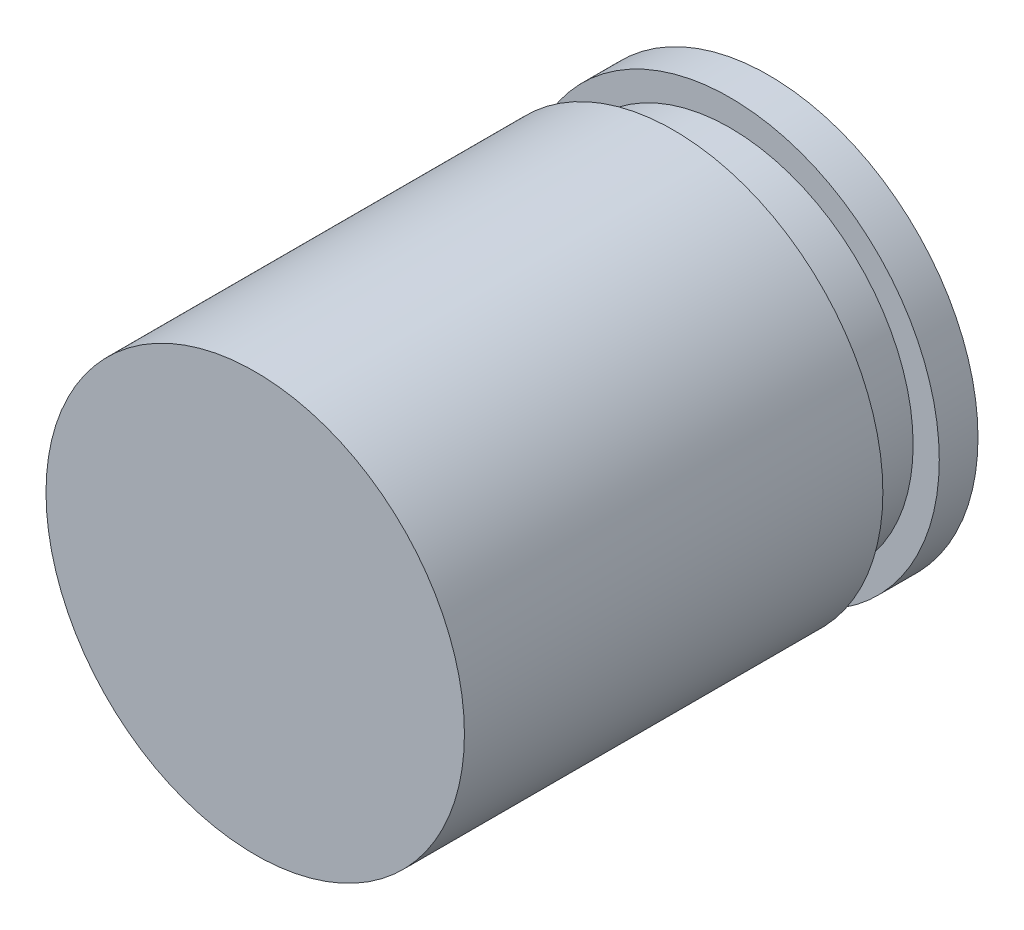
ISO-10303-21;
HEADER;
FILE_DESCRIPTION(('STEP AP214'),'2;1');
FILE_NAME('part.step','',(''),(''),'','','');
FILE_SCHEMA(('AUTOMOTIVE_DESIGN { 1 0 10303 214 1 1 1 1 }'));
ENDSEC;
DATA;
#1=APPLICATION_CONTEXT('core data for automotive mechanical design processes');
#2=APPLICATION_PROTOCOL_DEFINITION('international standard','automotive_design',2000,#1);
#3=PRODUCT_CONTEXT('',#1,'mechanical');
#4=PRODUCT('Part','Part','',(#3));
#5=PRODUCT_RELATED_PRODUCT_CATEGORY('part','',(#4));
#6=PRODUCT_DEFINITION_FORMATION('','',#4);
#7=PRODUCT_DEFINITION_CONTEXT('part definition',#1,'design');
#8=PRODUCT_DEFINITION('design','',#6,#7);
#9=PRODUCT_DEFINITION_SHAPE('','',#8);
#10=(LENGTH_UNIT() NAMED_UNIT(*) SI_UNIT(.MILLI.,.METRE.));
#11=(NAMED_UNIT(*) PLANE_ANGLE_UNIT() SI_UNIT($,.RADIAN.));
#12=(NAMED_UNIT(*) SI_UNIT($,.STERADIAN.) SOLID_ANGLE_UNIT());
#13=UNCERTAINTY_MEASURE_WITH_UNIT(LENGTH_MEASURE(1.E-05),#10,'distance_accuracy_value','');
#14=(GEOMETRIC_REPRESENTATION_CONTEXT(3) GLOBAL_UNCERTAINTY_ASSIGNED_CONTEXT((#13)) GLOBAL_UNIT_ASSIGNED_CONTEXT((#10,
#11,#12)) REPRESENTATION_CONTEXT('',''));
#15=CARTESIAN_POINT('',(0.,0.,0.));
#16=DIRECTION('',(0.,0.,1.));
#17=DIRECTION('',(1.,0.,0.));
#18=AXIS2_PLACEMENT_3D('',#15,#16,#17);
#19=CARTESIAN_POINT('',(0.,0.,0.266633333333));
#20=DIRECTION('',(0.,0.,1.));
#21=DIRECTION('',(1.,0.,0.));
#22=AXIS2_PLACEMENT_3D('',#19,#20,#21);
#23=PLANE('',#22);
#24=CARTESIAN_POINT('',(0.,0.,0.266633333333));
#25=DIRECTION('',(0.,0.,1.));
#26=DIRECTION('',(1.,0.,0.));
#27=AXIS2_PLACEMENT_3D('',#24,#25,#26);
#28=CIRCLE('',#27,3.15);
#29=CARTESIAN_POINT('',(3.15,0.,0.266633333333));
#30=VERTEX_POINT('',#29);
#31=EDGE_CURVE('E18',#30,#30,#28,.T.);
#32=ORIENTED_EDGE('',*,*,#31,.F.);
#33=EDGE_LOOP('',(#32));
#34=FACE_BOUND('',#33,.T.);
#35=ADVANCED_FACE('F15',(#34),#23,.F.);
#36=CARTESIAN_POINT('',(0.,0.,0.));
#37=DIRECTION('',(0.,0.,1.));
#38=DIRECTION('',(1.,0.,0.));
#39=AXIS2_PLACEMENT_3D('',#36,#37,#38);
#40=CYLINDRICAL_SURFACE('',#39,3.15);
#41=ORIENTED_EDGE('',*,*,#31,.T.);
#42=EDGE_LOOP('',(#41));
#43=FACE_BOUND('',#42,.T.);
#44=CARTESIAN_POINT('',(0.,0.,0.8495));
#45=DIRECTION('',(0.,0.,1.));
#46=DIRECTION('',(1.,0.,0.));
#47=AXIS2_PLACEMENT_3D('',#44,#45,#46);
#48=CIRCLE('',#47,3.15);
#49=CARTESIAN_POINT('',(3.15,0.,0.8495));
#50=VERTEX_POINT('',#49);
#51=EDGE_CURVE('E34',#50,#50,#48,.T.);
#52=ORIENTED_EDGE('',*,*,#51,.F.);
#53=EDGE_LOOP('',(#52));
#54=FACE_BOUND('',#53,.T.);
#55=ADVANCED_FACE('F41',(#43,#54),#40,.T.);
#56=CARTESIAN_POINT('',(0.,0.,0.8495));
#57=DIRECTION('',(0.,0.,1.));
#58=DIRECTION('',(1.,0.,0.));
#59=AXIS2_PLACEMENT_3D('',#56,#57,#58);
#60=PLANE('',#59);
#61=CARTESIAN_POINT('',(0.,0.,0.8495));
#62=DIRECTION('',(0.,0.,1.));
#63=DIRECTION('',(1.,0.,0.));
#64=AXIS2_PLACEMENT_3D('',#61,#62,#63);
#65=CIRCLE('',#64,2.75625);
#66=CARTESIAN_POINT('',(2.75625,0.,0.8495));
#67=VERTEX_POINT('',#66);
#68=EDGE_CURVE('E32',#67,#67,#65,.T.);
#69=ORIENTED_EDGE('',*,*,#68,.F.);
#70=EDGE_LOOP('',(#69));
#71=FACE_BOUND('',#70,.T.);
#72=ORIENTED_EDGE('',*,*,#51,.T.);
#73=EDGE_LOOP('',(#72));
#74=FACE_BOUND('',#73,.T.);
#75=ADVANCED_FACE('F49',(#71,#74),#60,.T.);
#76=CARTESIAN_POINT('',(0.,0.,0.8495));
#77=DIRECTION('',(0.,0.,1.));
#78=DIRECTION('',(1.,0.,0.));
#79=AXIS2_PLACEMENT_3D('',#76,#77,#78);
#80=CYLINDRICAL_SURFACE('',#79,2.75625);
#81=CARTESIAN_POINT('',(0.,0.,1.699));
#82=DIRECTION('',(0.,0.,1.));
#83=DIRECTION('',(1.,0.,0.));
#84=AXIS2_PLACEMENT_3D('',#81,#82,#83);
#85=CIRCLE('',#84,2.75625);
#86=CARTESIAN_POINT('',(2.75625,0.,1.699));
#87=VERTEX_POINT('',#86);
#88=EDGE_CURVE('E27',#87,#87,#85,.F.);
#89=ORIENTED_EDGE('',*,*,#88,.T.);
#90=EDGE_LOOP('',(#89));
#91=FACE_BOUND('',#90,.T.);
#92=ORIENTED_EDGE('',*,*,#68,.T.);
#93=EDGE_LOOP('',(#92));
#94=FACE_BOUND('',#93,.T.);
#95=ADVANCED_FACE('F64',(#91,#94),#80,.T.);
#96=CARTESIAN_POINT('',(0.,0.,1.699));
#97=DIRECTION('',(0.,0.,1.));
#98=DIRECTION('',(1.,0.,0.));
#99=AXIS2_PLACEMENT_3D('',#96,#97,#98);
#100=PLANE('',#99);
#101=CARTESIAN_POINT('',(0.,0.,1.699));
#102=DIRECTION('',(0.,0.,1.));
#103=DIRECTION('',(1.,0.,0.));
#104=AXIS2_PLACEMENT_3D('',#101,#102,#103);
#105=CIRCLE('',#104,3.15);
#106=CARTESIAN_POINT('',(3.15,0.,1.699));
#107=VERTEX_POINT('',#106);
#108=EDGE_CURVE('E22',#107,#107,#105,.T.);
#109=ORIENTED_EDGE('',*,*,#108,.F.);
#110=EDGE_LOOP('',(#109));
#111=FACE_BOUND('',#110,.T.);
#112=ORIENTED_EDGE('',*,*,#88,.F.);
#113=EDGE_LOOP('',(#112));
#114=FACE_BOUND('',#113,.T.);
#115=ADVANCED_FACE('F57',(#111,#114),#100,.F.);
#116=CARTESIAN_POINT('',(0.,0.,7.999));
#117=DIRECTION('',(0.,0.,1.));
#118=DIRECTION('',(1.,0.,0.));
#119=AXIS2_PLACEMENT_3D('',#116,#117,#118);
#120=PLANE('',#119);
#121=CARTESIAN_POINT('',(0.,0.,7.999));
#122=DIRECTION('',(0.,0.,1.));
#123=DIRECTION('',(1.,0.,0.));
#124=AXIS2_PLACEMENT_3D('',#121,#122,#123);
#125=CIRCLE('',#124,3.15);
#126=CARTESIAN_POINT('',(3.15,0.,7.999));
#127=VERTEX_POINT('',#126);
#128=EDGE_CURVE('E10',#127,#127,#125,.F.);
#129=ORIENTED_EDGE('',*,*,#128,.F.);
#130=EDGE_LOOP('',(#129));
#131=FACE_BOUND('',#130,.T.);
#132=ADVANCED_FACE('F52',(#131),#120,.T.);
#133=CARTESIAN_POINT('',(0.,0.,1.699));
#134=DIRECTION('',(0.,0.,1.));
#135=DIRECTION('',(1.,0.,0.));
#136=AXIS2_PLACEMENT_3D('',#133,#134,#135);
#137=CYLINDRICAL_SURFACE('',#136,3.15);
#138=ORIENTED_EDGE('',*,*,#128,.T.);
#139=EDGE_LOOP('',(#138));
#140=FACE_BOUND('',#139,.T.);
#141=ORIENTED_EDGE('',*,*,#108,.T.);
#142=EDGE_LOOP('',(#141));
#143=FACE_BOUND('',#142,.T.);
#144=ADVANCED_FACE('F50',(#140,#143),#137,.T.);
#145=CLOSED_SHELL('',(#35,#55,#75,#95,#115,#132,#144));
#146=MANIFOLD_SOLID_BREP('B1',#145);
#147=ADVANCED_BREP_SHAPE_REPRESENTATION('',(#18,#146),#14);
#148=SHAPE_DEFINITION_REPRESENTATION(#9,#147);
ENDSEC;
END-ISO-10303-21;
